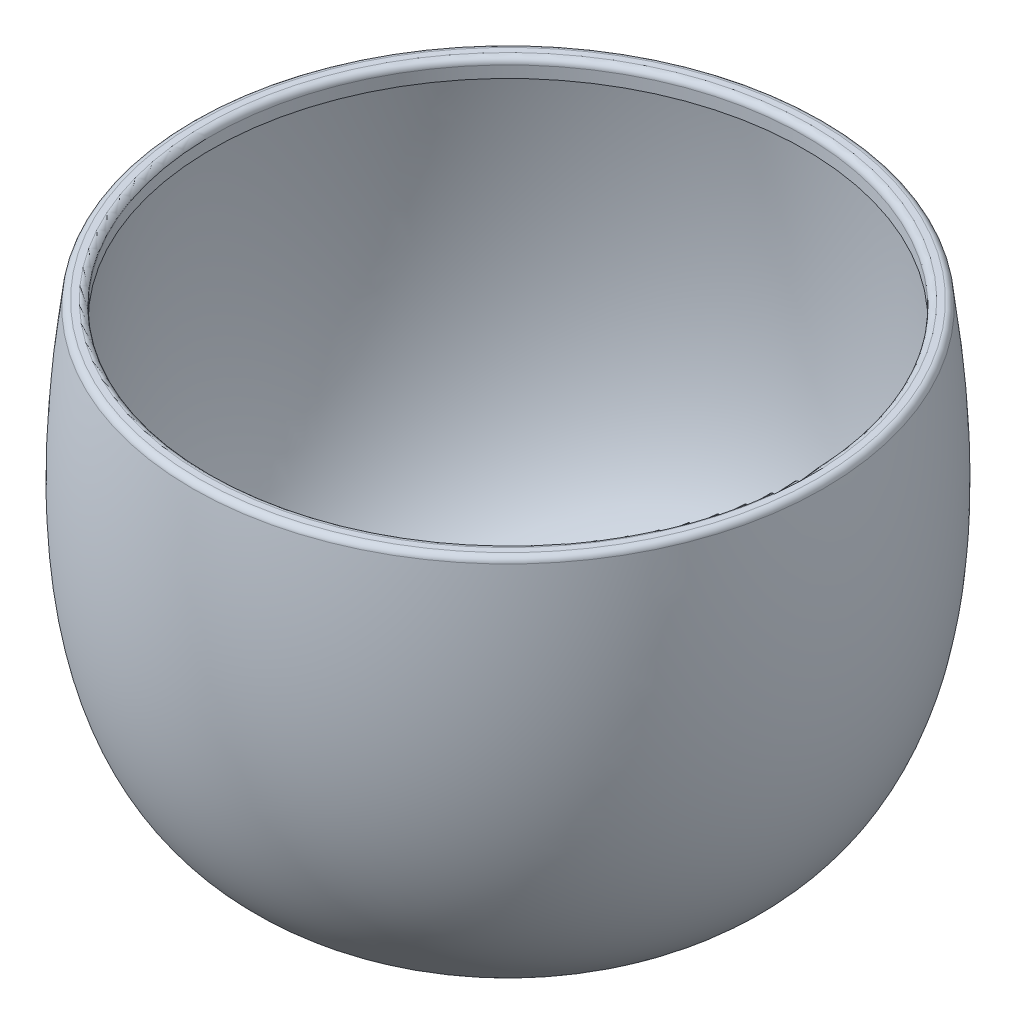
ISO-10303-21;
HEADER;
FILE_DESCRIPTION(('STEP AP214'),'2;1');
FILE_NAME('part.step','',(''),(''),'','','');
FILE_SCHEMA(('AUTOMOTIVE_DESIGN { 1 0 10303 214 1 1 1 1 }'));
ENDSEC;
DATA;
#1=APPLICATION_CONTEXT('core data for automotive mechanical design processes');
#2=APPLICATION_PROTOCOL_DEFINITION('international standard','automotive_design',2000,#1);
#3=PRODUCT_CONTEXT('',#1,'mechanical');
#4=PRODUCT('Part','Part','',(#3));
#5=PRODUCT_RELATED_PRODUCT_CATEGORY('part','',(#4));
#6=PRODUCT_DEFINITION_FORMATION('','',#4);
#7=PRODUCT_DEFINITION_CONTEXT('part definition',#1,'design');
#8=PRODUCT_DEFINITION('design','',#6,#7);
#9=PRODUCT_DEFINITION_SHAPE('','',#8);
#10=(LENGTH_UNIT() NAMED_UNIT(*) SI_UNIT(.MILLI.,.METRE.));
#11=(NAMED_UNIT(*) PLANE_ANGLE_UNIT() SI_UNIT($,.RADIAN.));
#12=(NAMED_UNIT(*) SI_UNIT($,.STERADIAN.) SOLID_ANGLE_UNIT());
#13=UNCERTAINTY_MEASURE_WITH_UNIT(LENGTH_MEASURE(1.E-05),#10,'distance_accuracy_value','');
#14=(GEOMETRIC_REPRESENTATION_CONTEXT(3) GLOBAL_UNCERTAINTY_ASSIGNED_CONTEXT((#13)) GLOBAL_UNIT_ASSIGNED_CONTEXT((#10,
#11,#12)) REPRESENTATION_CONTEXT('',''));
#15=CARTESIAN_POINT('',(0.,0.,0.));
#16=DIRECTION('',(0.,0.,1.));
#17=DIRECTION('',(1.,0.,0.));
#18=AXIS2_PLACEMENT_3D('',#15,#16,#17);
#19=CARTESIAN_POINT('',(0.,55.6746624081377,9.0283404826549));
#20=DIRECTION('',(0.,-1.,0.));
#21=DIRECTION('',(0.,0.,-1.));
#22=AXIS2_PLACEMENT_3D('',#19,#20,#21);
#23=TOROIDAL_SURFACE('',#22,42.0013581062814,0.254);
#24=CARTESIAN_POINT('',(0.,55.9286624081376,9.0283404826549));
#25=DIRECTION('',(0.,1.,0.));
#26=DIRECTION('',(0.,0.,1.));
#27=AXIS2_PLACEMENT_3D('',#24,#25,#26);
#28=CIRCLE('',#27,42.0013581062814);
#29=CARTESIAN_POINT('',(0.,55.9286624081376,51.0296985889363));
#30=VERTEX_POINT('',#29);
#31=EDGE_CURVE('E44',#30,#30,#28,.F.);
#32=ORIENTED_EDGE('',*,*,#31,.F.);
#33=EDGE_LOOP('',(#32));
#34=FACE_BOUND('',#33,.T.);
#35=CARTESIAN_POINT('',(0.,55.7065157835036,9.0283404826549));
#36=DIRECTION('',(0.,-1.,0.));
#37=DIRECTION('',(0.,0.,-1.));
#38=AXIS2_PLACEMENT_3D('',#35,#36,#37);
#39=CIRCLE('',#38,42.2533528730481);
#40=CARTESIAN_POINT('',(0.,55.7065157835036,-33.2250123903932));
#41=VERTEX_POINT('',#40);
#42=EDGE_CURVE('E10',#41,#41,#39,.F.);
#43=ORIENTED_EDGE('',*,*,#42,.F.);
#44=EDGE_LOOP('',(#43));
#45=FACE_BOUND('',#44,.T.);
#46=ADVANCED_FACE('F37',(#34,#45),#23,.F.);
#47=CARTESIAN_POINT('',(0.,-2.49133759186236,9.0283404826549));
#48=DIRECTION('',(0.,-1.,0.));
#49=DIRECTION('',(0.,0.,-1.));
#50=AXIS2_PLACEMENT_3D('',#47,#48,#49);
#51=PLANE('',#50);
#52=CARTESIAN_POINT('',(0.,-2.49133759186236,9.0283404826549));
#53=DIRECTION('',(0.,-1.,0.));
#54=DIRECTION('',(0.,0.,-1.));
#55=AXIS2_PLACEMENT_3D('',#52,#53,#54);
#56=CIRCLE('',#55,24.9813429274609);
#57=CARTESIAN_POINT('',(0.,-2.49133759186236,-15.953002444806));
#58=VERTEX_POINT('',#57);
#59=EDGE_CURVE('E68',#58,#58,#56,.T.);
#60=ORIENTED_EDGE('',*,*,#59,.F.);
#61=EDGE_LOOP('',(#60));
#62=FACE_BOUND('',#61,.T.);
#63=ADVANCED_FACE('F107',(#62),#51,.F.);
#64=CARTESIAN_POINT('',(0.,-5.03133759186236,-16.3716595173451));
#65=CARTESIAN_POINT('',(0.,3.76348957628727,-42.9760117006831));
#66=CARTESIAN_POINT('',(0.,58.4686624081376,-35.4216595173451));
#67=B_SPLINE_CURVE_WITH_KNOTS('',2,(#64,#65,#66),.UNSPECIFIED.,.F.,.F.,(3,3),(0.,
0.722997569507909),.UNSPECIFIED.);
#68=CARTESIAN_POINT('',(0.,-5.03133759186236,9.0283404826549));
#69=DIRECTION('',(0.,-1.,0.));
#70=AXIS1_PLACEMENT('',#68,#69);
#71=SURFACE_OF_REVOLUTION('',#67,#70);
#72=OFFSET_SURFACE('',#71,2.54,.F.);
#73=ORIENTED_EDGE('',*,*,#42,.T.);
#74=EDGE_LOOP('',(#73));
#75=FACE_BOUND('',#74,.T.);
#76=ORIENTED_EDGE('',*,*,#59,.T.);
#77=EDGE_LOOP('',(#76));
#78=FACE_BOUND('',#77,.T.);
#79=ADVANCED_FACE('F90',(#75,#78),#72,.T.);
#80=CARTESIAN_POINT('',(0.,55.9286624081376,9.0283404826549));
#81=DIRECTION('',(0.,1.,0.));
#82=DIRECTION('',(0.,0.,1.));
#83=AXIS2_PLACEMENT_3D('',#80,#81,#82);
#84=PLANE('',#83);
#85=ORIENTED_EDGE('',*,*,#31,.T.);
#86=EDGE_LOOP('',(#85));
#87=FACE_BOUND('',#86,.T.);
#88=CARTESIAN_POINT('',(0.,55.9286624081376,9.0283404826549));
#89=DIRECTION('',(0.,1.,0.));
#90=DIRECTION('',(0.,0.,1.));
#91=AXIS2_PLACEMENT_3D('',#88,#89,#90);
#92=CIRCLE('',#91,41.91);
#93=CARTESIAN_POINT('',(0.,55.9286624081376,50.9383404826549));
#94=VERTEX_POINT('',#93);
#95=EDGE_CURVE('E133',#94,#94,#92,.T.);
#96=ORIENTED_EDGE('',*,*,#95,.T.);
#97=EDGE_LOOP('',(#96));
#98=FACE_BOUND('',#97,.T.);
#99=ADVANCED_FACE('F92',(#87,#98),#84,.F.);
#100=CARTESIAN_POINT('',(0.,55.9286624081376,9.0283404826549));
#101=DIRECTION('',(0.,1.,0.));
#102=DIRECTION('',(0.,0.,1.));
#103=AXIS2_PLACEMENT_3D('',#100,#101,#102);
#104=CYLINDRICAL_SURFACE('',#103,41.91);
#105=CARTESIAN_POINT('',(0.,57.5796624081376,9.0283404826549));
#106=DIRECTION('',(0.,1.,0.));
#107=DIRECTION('',(0.,0.,1.));
#108=AXIS2_PLACEMENT_3D('',#105,#106,#107);
#109=CIRCLE('',#108,41.91);
#110=CARTESIAN_POINT('',(0.,57.5796624081376,50.9383404826549));
#111=VERTEX_POINT('',#110);
#112=EDGE_CURVE('E64',#111,#111,#109,.T.);
#113=ORIENTED_EDGE('',*,*,#112,.T.);
#114=EDGE_LOOP('',(#113));
#115=FACE_BOUND('',#114,.T.);
#116=ORIENTED_EDGE('',*,*,#95,.F.);
#117=EDGE_LOOP('',(#116));
#118=FACE_BOUND('',#117,.T.);
#119=ADVANCED_FACE('F95',(#115,#118),#104,.F.);
#120=CARTESIAN_POINT('',(0.,-5.03133759186236,9.0283404826549));
#121=DIRECTION('',(0.,-1.,0.));
#122=DIRECTION('',(0.,0.,-1.));
#123=AXIS2_PLACEMENT_3D('',#120,#121,#122);
#124=PLANE('',#123);
#125=CARTESIAN_POINT('',(0.,-5.03133759186236,9.0283404826549));
#126=DIRECTION('',(0.,-1.,0.));
#127=DIRECTION('',(0.,0.,-1.));
#128=AXIS2_PLACEMENT_3D('',#125,#126,#127);
#129=CIRCLE('',#128,25.4);
#130=CARTESIAN_POINT('',(0.,-5.03133759186236,-16.3716595173451));
#131=VERTEX_POINT('',#130);
#132=EDGE_CURVE('E72',#131,#131,#129,.T.);
#133=ORIENTED_EDGE('',*,*,#132,.T.);
#134=EDGE_LOOP('',(#133));
#135=FACE_BOUND('',#134,.T.);
#136=ADVANCED_FACE('F88',(#135),#124,.T.);
#137=CARTESIAN_POINT('',(0.,-5.03133759186236,-16.3716595173451));
#138=CARTESIAN_POINT('',(0.,3.76348957628727,-42.9760117006831));
#139=CARTESIAN_POINT('',(0.,58.4686624081376,-35.4216595173451));
#140=B_SPLINE_CURVE_WITH_KNOTS('',2,(#137,#138,#139),.UNSPECIFIED.,.F.,.F.,(3,3),(0.,
0.722997569507909),.UNSPECIFIED.);
#141=CARTESIAN_POINT('',(0.,-5.03133759186236,9.0283404826549));
#142=DIRECTION('',(0.,-1.,0.));
#143=AXIS1_PLACEMENT('',#141,#142);
#144=SURFACE_OF_REVOLUTION('',#140,#143);
#145=CARTESIAN_POINT('',(0.,57.6981474828703,9.0283404826549));
#146=DIRECTION('',(0.,-1.,0.));
#147=DIRECTION('',(0.,0.,-1.));
#148=AXIS2_PLACEMENT_3D('',#145,#146,#147);
#149=CIRCLE('',#148,44.5550141094136);
#150=CARTESIAN_POINT('',(0.,57.6981474828703,-35.5266736267587));
#151=VERTEX_POINT('',#150);
#152=EDGE_CURVE('E49',#151,#151,#149,.T.);
#153=ORIENTED_EDGE('',*,*,#152,.T.);
#154=EDGE_LOOP('',(#153));
#155=FACE_BOUND('',#154,.T.);
#156=ORIENTED_EDGE('',*,*,#132,.F.);
#157=EDGE_LOOP('',(#156));
#158=FACE_BOUND('',#157,.T.);
#159=ADVANCED_FACE('F82',(#155,#158),#144,.F.);
#160=CARTESIAN_POINT('',(0.,58.4686624081376,9.0283404826549));
#161=DIRECTION('',(0.,1.,0.));
#162=DIRECTION('',(0.,0.,1.));
#163=AXIS2_PLACEMENT_3D('',#160,#161,#162);
#164=PLANE('',#163);
#165=CARTESIAN_POINT('',(0.,58.4686624081376,9.0283404826549));
#166=DIRECTION('',(0.,1.,0.));
#167=DIRECTION('',(0.,0.,1.));
#168=AXIS2_PLACEMENT_3D('',#165,#166,#167);
#169=CIRCLE('',#168,42.799);
#170=CARTESIAN_POINT('',(0.,58.4686624081376,51.8273404826549));
#171=VERTEX_POINT('',#170);
#172=EDGE_CURVE('E54',#171,#171,#169,.F.);
#173=ORIENTED_EDGE('',*,*,#172,.T.);
#174=EDGE_LOOP('',(#173));
#175=FACE_BOUND('',#174,.T.);
#176=CARTESIAN_POINT('',(0.,58.4686624081376,9.0283404826549));
#177=DIRECTION('',(0.,1.,0.));
#178=DIRECTION('',(0.,0.,1.));
#179=AXIS2_PLACEMENT_3D('',#176,#177,#178);
#180=CIRCLE('',#179,43.6739452772185);
#181=CARTESIAN_POINT('',(0.,58.4686624081376,52.7022857598734));
#182=VERTEX_POINT('',#181);
#183=EDGE_CURVE('E60',#182,#182,#180,.T.);
#184=ORIENTED_EDGE('',*,*,#183,.T.);
#185=EDGE_LOOP('',(#184));
#186=FACE_BOUND('',#185,.T.);
#187=ADVANCED_FACE('F87',(#175,#186),#164,.T.);
#188=CARTESIAN_POINT('',(0.,57.5796624081376,9.0283404826549));
#189=DIRECTION('',(0.,1.,0.));
#190=DIRECTION('',(0.,0.,1.));
#191=AXIS2_PLACEMENT_3D('',#188,#189,#190);
#192=TOROIDAL_SURFACE('',#191,42.799,0.889);
#193=ORIENTED_EDGE('',*,*,#172,.F.);
#194=EDGE_LOOP('',(#193));
#195=FACE_BOUND('',#194,.T.);
#196=ORIENTED_EDGE('',*,*,#112,.F.);
#197=EDGE_LOOP('',(#196));
#198=FACE_BOUND('',#197,.T.);
#199=ADVANCED_FACE('F96',(#195,#198),#192,.T.);
#200=CARTESIAN_POINT('',(0.,57.5796624081376,9.0283404826549));
#201=DIRECTION('',(0.,-1.,0.));
#202=DIRECTION('',(0.,0.,-1.));
#203=AXIS2_PLACEMENT_3D('',#200,#201,#202);
#204=TOROIDAL_SURFACE('',#203,43.6739452772185,0.889);
#205=ORIENTED_EDGE('',*,*,#183,.F.);
#206=EDGE_LOOP('',(#205));
#207=FACE_BOUND('',#206,.T.);
#208=ORIENTED_EDGE('',*,*,#152,.F.);
#209=EDGE_LOOP('',(#208));
#210=FACE_BOUND('',#209,.T.);
#211=ADVANCED_FACE('F98',(#207,#210),#204,.T.);
#212=CLOSED_SHELL('',(#46,#63,#79,#99,#119,#136,#159,#187,#199,#211));
#213=MANIFOLD_SOLID_BREP('B2',#212);
#214=ADVANCED_BREP_SHAPE_REPRESENTATION('',(#18,#213),#14);
#215=SHAPE_DEFINITION_REPRESENTATION(#9,#214);
ENDSEC;
END-ISO-10303-21;
